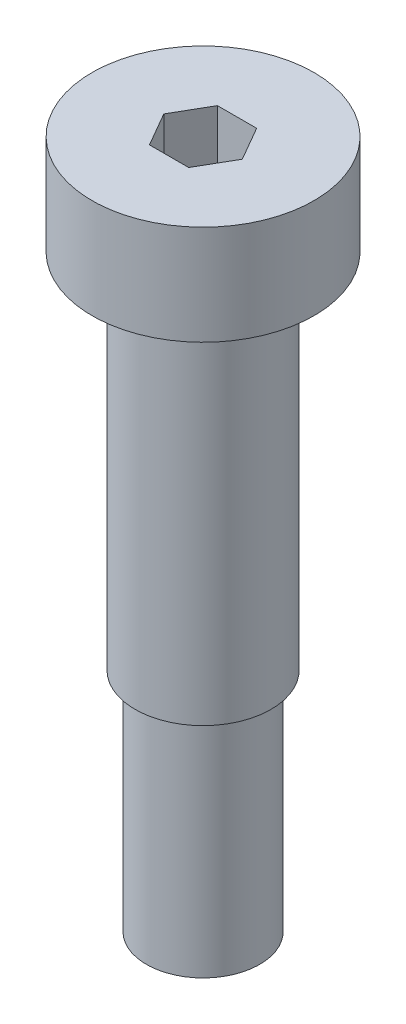
ISO-10303-21;
HEADER;
FILE_DESCRIPTION(('STEP AP214'),'2;1');
FILE_NAME('part.step','',(''),(''),'','','');
FILE_SCHEMA(('AUTOMOTIVE_DESIGN { 1 0 10303 214 1 1 1 1 }'));
ENDSEC;
DATA;
#1=APPLICATION_CONTEXT('core data for automotive mechanical design processes');
#2=APPLICATION_PROTOCOL_DEFINITION('international standard','automotive_design',2000,#1);
#3=PRODUCT_CONTEXT('',#1,'mechanical');
#4=PRODUCT('Part','Part','',(#3));
#5=PRODUCT_RELATED_PRODUCT_CATEGORY('part','',(#4));
#6=PRODUCT_DEFINITION_FORMATION('','',#4);
#7=PRODUCT_DEFINITION_CONTEXT('part definition',#1,'design');
#8=PRODUCT_DEFINITION('design','',#6,#7);
#9=PRODUCT_DEFINITION_SHAPE('','',#8);
#10=(LENGTH_UNIT() NAMED_UNIT(*) SI_UNIT(.MILLI.,.METRE.));
#11=(NAMED_UNIT(*) PLANE_ANGLE_UNIT() SI_UNIT($,.RADIAN.));
#12=(NAMED_UNIT(*) SI_UNIT($,.STERADIAN.) SOLID_ANGLE_UNIT());
#13=UNCERTAINTY_MEASURE_WITH_UNIT(LENGTH_MEASURE(1.E-05),#10,'distance_accuracy_value','');
#14=(GEOMETRIC_REPRESENTATION_CONTEXT(3) GLOBAL_UNCERTAINTY_ASSIGNED_CONTEXT((#13)) GLOBAL_UNIT_ASSIGNED_CONTEXT((#10,
#11,#12)) REPRESENTATION_CONTEXT('',''));
#15=CARTESIAN_POINT('',(0.,0.,0.));
#16=DIRECTION('',(0.,0.,1.));
#17=DIRECTION('',(1.,0.,0.));
#18=AXIS2_PLACEMENT_3D('',#15,#16,#17);
#19=CARTESIAN_POINT('',(2.5,0.,0.));
#20=DIRECTION('',(0.,-1.,0.));
#21=DIRECTION('',(0.,0.,-1.));
#22=AXIS2_PLACEMENT_3D('',#19,#20,#21);
#23=PLANE('',#22);
#24=CARTESIAN_POINT('',(0.,0.,0.));
#25=DIRECTION('',(0.,-1.,0.));
#26=DIRECTION('',(0.,0.,-1.));
#27=AXIS2_PLACEMENT_3D('',#24,#25,#26);
#28=CIRCLE('',#27,2.5);
#29=CARTESIAN_POINT('',(0.,0.,-2.5));
#30=VERTEX_POINT('',#29);
#31=EDGE_CURVE('E169',#30,#30,#28,.T.);
#32=ORIENTED_EDGE('',*,*,#31,.T.);
#33=EDGE_LOOP('',(#32));
#34=FACE_BOUND('',#33,.T.);
#35=ADVANCED_FACE('F54',(#34),#23,.T.);
#36=CARTESIAN_POINT('',(0.,30.4,0.));
#37=DIRECTION('',(0.,1.,0.));
#38=DIRECTION('',(0.,0.,1.));
#39=AXIS2_PLACEMENT_3D('',#36,#37,#38);
#40=PLANE('',#39);
#41=DIRECTION('',(0.5,0.,-0.866025403784439));
#42=VECTOR('',#41,1.);
#43=CARTESIAN_POINT('',(0.866025403784471,30.4,1.5));
#44=LINE('',#43,#42);
#45=CARTESIAN_POINT('',(0.866025403784471,30.4,1.5));
#46=VERTEX_POINT('',#45);
#47=CARTESIAN_POINT('',(1.73205080756891,30.4,0.));
#48=VERTEX_POINT('',#47);
#49=EDGE_CURVE('E69',#46,#48,#44,.T.);
#50=ORIENTED_EDGE('',*,*,#49,.F.);
#51=DIRECTION('',(1.,0.,0.));
#52=VECTOR('',#51,1.);
#53=CARTESIAN_POINT('',(-0.866025403784415,30.4,1.5));
#54=LINE('',#53,#52);
#55=CARTESIAN_POINT('',(-0.866025403784415,30.4,1.5));
#56=VERTEX_POINT('',#55);
#57=EDGE_CURVE('E163',#56,#46,#54,.T.);
#58=ORIENTED_EDGE('',*,*,#57,.F.);
#59=DIRECTION('',(0.500000000000001,0.,0.866025403784439));
#60=VECTOR('',#59,1.);
#61=CARTESIAN_POINT('',(-1.73205080756889,30.4,0.));
#62=LINE('',#61,#60);
#63=CARTESIAN_POINT('',(-1.73205080756889,30.4,0.));
#64=VERTEX_POINT('',#63);
#65=EDGE_CURVE('E160',#64,#56,#62,.T.);
#66=ORIENTED_EDGE('',*,*,#65,.F.);
#67=DIRECTION('',(-0.500000000000001,0.,0.866025403784439));
#68=VECTOR('',#67,1.);
#69=CARTESIAN_POINT('',(-0.866025403784443,30.4,-1.50000000000003));
#70=LINE('',#69,#68);
#71=CARTESIAN_POINT('',(-0.866025403784443,30.4,-1.50000000000003));
#72=VERTEX_POINT('',#71);
#73=EDGE_CURVE('E117',#72,#64,#70,.T.);
#74=ORIENTED_EDGE('',*,*,#73,.F.);
#75=DIRECTION('',(-1.,0.,0.));
#76=VECTOR('',#75,1.);
#77=CARTESIAN_POINT('',(0.866025403784443,30.4,-1.5));
#78=LINE('',#77,#76);
#79=CARTESIAN_POINT('',(0.866025403784443,30.4,-1.5));
#80=VERTEX_POINT('',#79);
#81=EDGE_CURVE('E154',#80,#72,#78,.T.);
#82=ORIENTED_EDGE('',*,*,#81,.F.);
#83=DIRECTION('',(-0.500000000000001,0.,-0.866025403784439));
#84=VECTOR('',#83,1.);
#85=CARTESIAN_POINT('',(1.73205080756891,30.4,0.));
#86=LINE('',#85,#84);
#87=EDGE_CURVE('E150',#48,#80,#86,.T.);
#88=ORIENTED_EDGE('',*,*,#87,.F.);
#89=EDGE_LOOP('',(#50,#58,#66,#74,#82,#88));
#90=FACE_BOUND('',#89,.T.);
#91=CARTESIAN_POINT('',(0.,30.4,0.));
#92=DIRECTION('',(0.,-1.,0.));
#93=DIRECTION('',(0.,0.,-1.));
#94=AXIS2_PLACEMENT_3D('',#91,#92,#93);
#95=CIRCLE('',#94,4.9);
#96=CARTESIAN_POINT('',(0.,30.4,-4.9));
#97=VERTEX_POINT('',#96);
#98=EDGE_CURVE('E13',#97,#97,#95,.T.);
#99=ORIENTED_EDGE('',*,*,#98,.F.);
#100=EDGE_LOOP('',(#99));
#101=FACE_BOUND('',#100,.T.);
#102=ADVANCED_FACE('F203',(#90,#101),#40,.T.);
#103=CARTESIAN_POINT('',(0.,0.,0.));
#104=DIRECTION('',(0.,-1.,0.));
#105=DIRECTION('',(0.,0.,-1.));
#106=AXIS2_PLACEMENT_3D('',#103,#104,#105);
#107=CYLINDRICAL_SURFACE('',#106,4.9);
#108=ORIENTED_EDGE('',*,*,#98,.T.);
#109=EDGE_LOOP('',(#108));
#110=FACE_BOUND('',#109,.T.);
#111=CARTESIAN_POINT('',(0.,26.,0.));
#112=DIRECTION('',(0.,-1.,0.));
#113=DIRECTION('',(0.,0.,-1.));
#114=AXIS2_PLACEMENT_3D('',#111,#112,#113);
#115=CIRCLE('',#114,4.9);
#116=CARTESIAN_POINT('',(0.,26.,-4.90000000000003));
#117=VERTEX_POINT('',#116);
#118=EDGE_CURVE('E62',#117,#117,#115,.T.);
#119=ORIENTED_EDGE('',*,*,#118,.F.);
#120=EDGE_LOOP('',(#119));
#121=FACE_BOUND('',#120,.T.);
#122=ADVANCED_FACE('F201',(#110,#121),#107,.T.);
#123=CARTESIAN_POINT('',(4.90000000000002,26.,0.));
#124=DIRECTION('',(0.,-1.,0.));
#125=DIRECTION('',(0.,0.,-1.));
#126=AXIS2_PLACEMENT_3D('',#123,#124,#125);
#127=PLANE('',#126);
#128=ORIENTED_EDGE('',*,*,#118,.T.);
#129=EDGE_LOOP('',(#128));
#130=FACE_BOUND('',#129,.T.);
#131=CARTESIAN_POINT('',(0.,26.,0.));
#132=DIRECTION('',(0.,-1.,0.));
#133=DIRECTION('',(0.,0.,-1.));
#134=AXIS2_PLACEMENT_3D('',#131,#132,#133);
#135=CIRCLE('',#134,3.);
#136=CARTESIAN_POINT('',(0.,26.,-3.00000000000003));
#137=VERTEX_POINT('',#136);
#138=EDGE_CURVE('E190',#137,#137,#135,.T.);
#139=ORIENTED_EDGE('',*,*,#138,.F.);
#140=EDGE_LOOP('',(#139));
#141=FACE_BOUND('',#140,.T.);
#142=ADVANCED_FACE('F198',(#130,#141),#127,.T.);
#143=CARTESIAN_POINT('',(0.,0.,0.));
#144=DIRECTION('',(0.,-1.,0.));
#145=DIRECTION('',(0.,0.,-1.));
#146=AXIS2_PLACEMENT_3D('',#143,#144,#145);
#147=CYLINDRICAL_SURFACE('',#146,3.);
#148=ORIENTED_EDGE('',*,*,#138,.T.);
#149=EDGE_LOOP('',(#148));
#150=FACE_BOUND('',#149,.T.);
#151=CARTESIAN_POINT('',(0.,9.99999999999999,0.));
#152=DIRECTION('',(0.,-1.,0.));
#153=DIRECTION('',(0.,0.,-1.));
#154=AXIS2_PLACEMENT_3D('',#151,#152,#153);
#155=CIRCLE('',#154,3.);
#156=CARTESIAN_POINT('',(0.,9.99999999999999,-3.00000000000003));
#157=VERTEX_POINT('',#156);
#158=EDGE_CURVE('E186',#157,#157,#155,.T.);
#159=ORIENTED_EDGE('',*,*,#158,.F.);
#160=EDGE_LOOP('',(#159));
#161=FACE_BOUND('',#160,.T.);
#162=ADVANCED_FACE('F210',(#150,#161),#147,.T.);
#163=CARTESIAN_POINT('',(3.00000000000003,9.99999999999999,0.));
#164=DIRECTION('',(0.,-1.,0.));
#165=DIRECTION('',(0.,0.,-1.));
#166=AXIS2_PLACEMENT_3D('',#163,#164,#165);
#167=PLANE('',#166);
#168=ORIENTED_EDGE('',*,*,#158,.T.);
#169=EDGE_LOOP('',(#168));
#170=FACE_BOUND('',#169,.T.);
#171=CARTESIAN_POINT('',(0.,9.99999999999999,0.));
#172=DIRECTION('',(0.,-1.,0.));
#173=DIRECTION('',(0.,0.,-1.));
#174=AXIS2_PLACEMENT_3D('',#171,#172,#173);
#175=CIRCLE('',#174,2.5);
#176=CARTESIAN_POINT('',(0.,9.99999999999999,-2.50000000000003));
#177=VERTEX_POINT('',#176);
#178=EDGE_CURVE('E182',#177,#177,#175,.T.);
#179=ORIENTED_EDGE('',*,*,#178,.F.);
#180=EDGE_LOOP('',(#179));
#181=FACE_BOUND('',#180,.T.);
#182=ADVANCED_FACE('F222',(#170,#181),#167,.T.);
#183=CARTESIAN_POINT('',(0.,0.,0.));
#184=DIRECTION('',(0.,-1.,0.));
#185=DIRECTION('',(0.,0.,-1.));
#186=AXIS2_PLACEMENT_3D('',#183,#184,#185);
#187=CYLINDRICAL_SURFACE('',#186,2.5);
#188=ORIENTED_EDGE('',*,*,#178,.T.);
#189=EDGE_LOOP('',(#188));
#190=FACE_BOUND('',#189,.T.);
#191=ORIENTED_EDGE('',*,*,#31,.F.);
#192=EDGE_LOOP('',(#191));
#193=FACE_BOUND('',#192,.T.);
#194=ADVANCED_FACE('F219',(#190,#193),#187,.T.);
#195=CARTESIAN_POINT('',(0.866025403784443,27.4,1.49999999999997));
#196=DIRECTION('',(0.866025403784439,0.,0.5));
#197=DIRECTION('',(0.5,0.,-0.866025403784439));
#198=AXIS2_PLACEMENT_3D('',#195,#196,#197);
#199=PLANE('',#198);
#200=ORIENTED_EDGE('',*,*,#49,.T.);
#201=DIRECTION('',(0.,1.,0.));
#202=VECTOR('',#201,1.);
#203=CARTESIAN_POINT('',(1.73205080756889,27.4,0.));
#204=LINE('',#203,#202);
#205=CARTESIAN_POINT('',(1.73205080756889,27.4,0.));
#206=VERTEX_POINT('',#205);
#207=EDGE_CURVE('E99',#206,#48,#204,.T.);
#208=ORIENTED_EDGE('',*,*,#207,.F.);
#209=DIRECTION('',(0.5,0.,-0.866025403784439));
#210=VECTOR('',#209,1.);
#211=CARTESIAN_POINT('',(0.866025403784443,27.4,1.49999999999997));
#212=LINE('',#211,#210);
#213=CARTESIAN_POINT('',(0.866025403784443,27.4,1.49999999999997));
#214=VERTEX_POINT('',#213);
#215=EDGE_CURVE('E166',#214,#206,#212,.T.);
#216=ORIENTED_EDGE('',*,*,#215,.F.);
#217=DIRECTION('',(0.,1.,0.));
#218=VECTOR('',#217,1.);
#219=CARTESIAN_POINT('',(0.866025403784443,27.4,1.49999999999997));
#220=LINE('',#219,#218);
#221=EDGE_CURVE('E77',#214,#46,#220,.T.);
#222=ORIENTED_EDGE('',*,*,#221,.T.);
#223=EDGE_LOOP('',(#200,#208,#216,#222));
#224=FACE_BOUND('',#223,.T.);
#225=ADVANCED_FACE('F221',(#224),#199,.F.);
#226=CARTESIAN_POINT('',(-0.866025403784443,27.4,1.50000000000003));
#227=DIRECTION('',(0.,0.,1.));
#228=DIRECTION('',(1.,0.,0.));
#229=AXIS2_PLACEMENT_3D('',#226,#227,#228);
#230=PLANE('',#229);
#231=ORIENTED_EDGE('',*,*,#57,.T.);
#232=ORIENTED_EDGE('',*,*,#221,.F.);
#233=DIRECTION('',(1.,0.,0.));
#234=VECTOR('',#233,1.);
#235=CARTESIAN_POINT('',(-0.866025403784443,27.4,1.50000000000003));
#236=LINE('',#235,#234);
#237=CARTESIAN_POINT('',(-0.866025403784443,27.4,1.50000000000003));
#238=VERTEX_POINT('',#237);
#239=EDGE_CURVE('E131',#238,#214,#236,.T.);
#240=ORIENTED_EDGE('',*,*,#239,.F.);
#241=DIRECTION('',(0.,1.,0.));
#242=VECTOR('',#241,1.);
#243=CARTESIAN_POINT('',(-0.866025403784443,27.4,1.50000000000003));
#244=LINE('',#243,#242);
#245=EDGE_CURVE('E122',#238,#56,#244,.T.);
#246=ORIENTED_EDGE('',*,*,#245,.T.);
#247=EDGE_LOOP('',(#231,#232,#240,#246));
#248=FACE_BOUND('',#247,.T.);
#249=ADVANCED_FACE('F229',(#248),#230,.F.);
#250=CARTESIAN_POINT('',(-1.73205080756891,27.4,0.));
#251=DIRECTION('',(-0.866025403784439,0.,0.500000000000001));
#252=DIRECTION('',(0.500000000000001,0.,0.866025403784439));
#253=AXIS2_PLACEMENT_3D('',#250,#251,#252);
#254=PLANE('',#253);
#255=ORIENTED_EDGE('',*,*,#65,.T.);
#256=ORIENTED_EDGE('',*,*,#245,.F.);
#257=DIRECTION('',(0.500000000000001,0.,0.866025403784439));
#258=VECTOR('',#257,1.);
#259=CARTESIAN_POINT('',(-1.73205080756891,27.4,0.));
#260=LINE('',#259,#258);
#261=CARTESIAN_POINT('',(-1.73205080756891,27.4,0.));
#262=VERTEX_POINT('',#261);
#263=EDGE_CURVE('E126',#262,#238,#260,.T.);
#264=ORIENTED_EDGE('',*,*,#263,.F.);
#265=DIRECTION('',(0.,1.,0.));
#266=VECTOR('',#265,1.);
#267=CARTESIAN_POINT('',(-1.73205080756891,27.4,0.));
#268=LINE('',#267,#266);
#269=EDGE_CURVE('E110',#262,#64,#268,.T.);
#270=ORIENTED_EDGE('',*,*,#269,.T.);
#271=EDGE_LOOP('',(#255,#256,#264,#270));
#272=FACE_BOUND('',#271,.T.);
#273=ADVANCED_FACE('F127',(#272),#254,.F.);
#274=CARTESIAN_POINT('',(-0.866025403784443,27.4,-1.5));
#275=DIRECTION('',(-0.866025403784439,0.,-0.500000000000001));
#276=DIRECTION('',(-0.500000000000001,0.,0.866025403784439));
#277=AXIS2_PLACEMENT_3D('',#274,#275,#276);
#278=PLANE('',#277);
#279=ORIENTED_EDGE('',*,*,#73,.T.);
#280=ORIENTED_EDGE('',*,*,#269,.F.);
#281=DIRECTION('',(-0.500000000000001,0.,0.866025403784439));
#282=VECTOR('',#281,1.);
#283=CARTESIAN_POINT('',(-0.866025403784443,27.4,-1.5));
#284=LINE('',#283,#282);
#285=CARTESIAN_POINT('',(-0.866025403784443,27.4,-1.5));
#286=VERTEX_POINT('',#285);
#287=EDGE_CURVE('E114',#286,#262,#284,.T.);
#288=ORIENTED_EDGE('',*,*,#287,.F.);
#289=DIRECTION('',(0.,1.,0.));
#290=VECTOR('',#289,1.);
#291=CARTESIAN_POINT('',(-0.866025403784443,27.4,-1.5));
#292=LINE('',#291,#290);
#293=EDGE_CURVE('E123',#286,#72,#292,.T.);
#294=ORIENTED_EDGE('',*,*,#293,.T.);
#295=EDGE_LOOP('',(#279,#280,#288,#294));
#296=FACE_BOUND('',#295,.T.);
#297=ADVANCED_FACE('F112',(#296),#278,.F.);
#298=CARTESIAN_POINT('',(0.866025403784443,27.4,-1.5));
#299=DIRECTION('',(0.,0.,-1.));
#300=DIRECTION('',(-1.,0.,0.));
#301=AXIS2_PLACEMENT_3D('',#298,#299,#300);
#302=PLANE('',#301);
#303=ORIENTED_EDGE('',*,*,#81,.T.);
#304=ORIENTED_EDGE('',*,*,#293,.F.);
#305=DIRECTION('',(-1.,0.,0.));
#306=VECTOR('',#305,1.);
#307=CARTESIAN_POINT('',(0.866025403784443,27.4,-1.5));
#308=LINE('',#307,#306);
#309=CARTESIAN_POINT('',(0.866025403784443,27.4,-1.5));
#310=VERTEX_POINT('',#309);
#311=EDGE_CURVE('E137',#310,#286,#308,.T.);
#312=ORIENTED_EDGE('',*,*,#311,.F.);
#313=DIRECTION('',(0.,1.,0.));
#314=VECTOR('',#313,1.);
#315=CARTESIAN_POINT('',(0.866025403784443,27.4,-1.5));
#316=LINE('',#315,#314);
#317=EDGE_CURVE('E174',#310,#80,#316,.T.);
#318=ORIENTED_EDGE('',*,*,#317,.T.);
#319=EDGE_LOOP('',(#303,#304,#312,#318));
#320=FACE_BOUND('',#319,.T.);
#321=ADVANCED_FACE('F290',(#320),#302,.F.);
#322=CARTESIAN_POINT('',(1.73205080756889,27.4,0.));
#323=DIRECTION('',(0.866025403784439,0.,-0.500000000000001));
#324=DIRECTION('',(-0.500000000000001,0.,-0.866025403784439));
#325=AXIS2_PLACEMENT_3D('',#322,#323,#324);
#326=PLANE('',#325);
#327=ORIENTED_EDGE('',*,*,#87,.T.);
#328=ORIENTED_EDGE('',*,*,#317,.F.);
#329=DIRECTION('',(-0.500000000000001,0.,-0.866025403784439));
#330=VECTOR('',#329,1.);
#331=CARTESIAN_POINT('',(1.73205080756889,27.4,0.));
#332=LINE('',#331,#330);
#333=EDGE_CURVE('E142',#206,#310,#332,.T.);
#334=ORIENTED_EDGE('',*,*,#333,.F.);
#335=ORIENTED_EDGE('',*,*,#207,.T.);
#336=EDGE_LOOP('',(#327,#328,#334,#335));
#337=FACE_BOUND('',#336,.T.);
#338=ADVANCED_FACE('F299',(#337),#326,.F.);
#339=CARTESIAN_POINT('',(0.,27.4,0.));
#340=DIRECTION('',(0.,1.,0.));
#341=DIRECTION('',(0.,0.,1.));
#342=AXIS2_PLACEMENT_3D('',#339,#340,#341);
#343=PLANE('',#342);
#344=ORIENTED_EDGE('',*,*,#215,.T.);
#345=ORIENTED_EDGE('',*,*,#333,.T.);
#346=ORIENTED_EDGE('',*,*,#311,.T.);
#347=ORIENTED_EDGE('',*,*,#287,.T.);
#348=ORIENTED_EDGE('',*,*,#263,.T.);
#349=ORIENTED_EDGE('',*,*,#239,.T.);
#350=EDGE_LOOP('',(#344,#345,#346,#347,#348,#349));
#351=FACE_BOUND('',#350,.T.);
#352=ADVANCED_FACE('F134',(#351),#343,.T.);
#353=CLOSED_SHELL('',(#35,#102,#122,#142,#162,#182,#194,#225,#249,#273,#297,#321,#338,#352));
#354=MANIFOLD_SOLID_BREP('B2',#353);
#355=ADVANCED_BREP_SHAPE_REPRESENTATION('',(#18,#354),#14);
#356=SHAPE_DEFINITION_REPRESENTATION(#9,#355);
ENDSEC;
END-ISO-10303-21;
